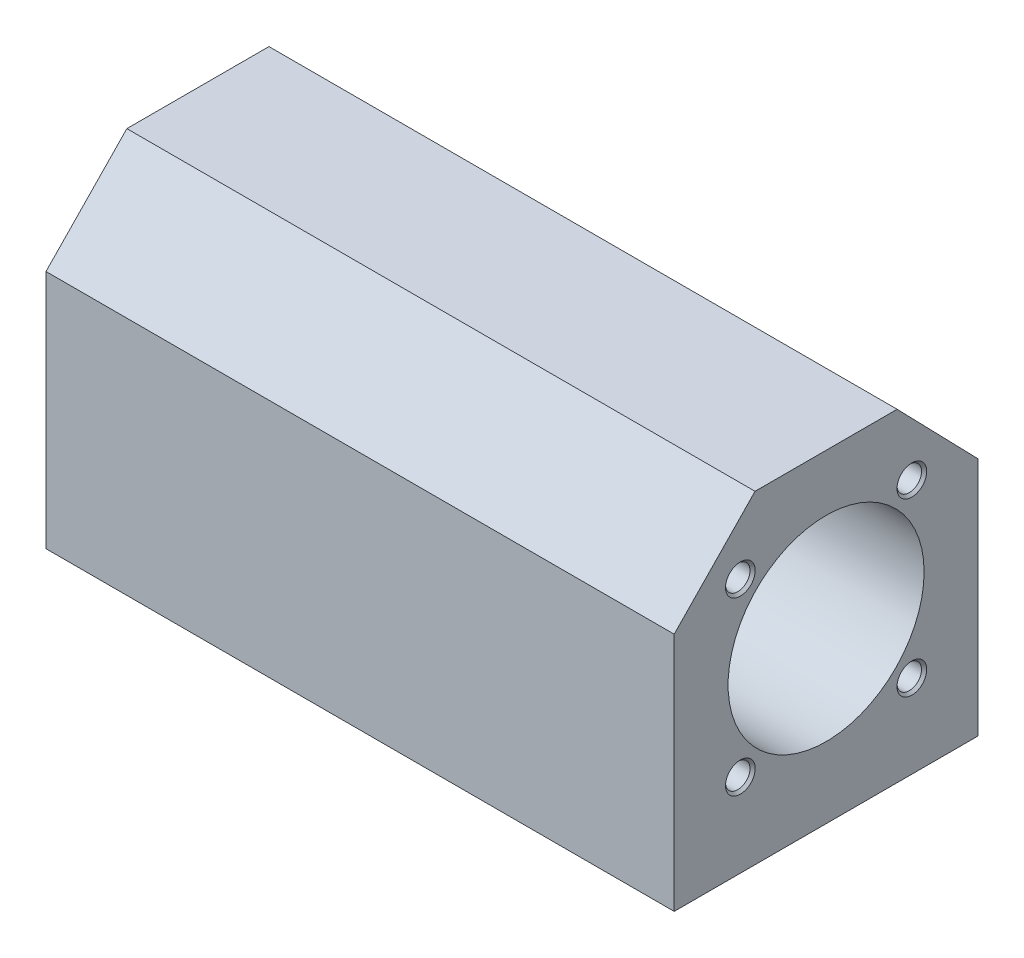
ISO-10303-21;
HEADER;
FILE_DESCRIPTION(('STEP AP214'),'2;1');
FILE_NAME('part.step','',(''),(''),'','','');
FILE_SCHEMA(('AUTOMOTIVE_DESIGN { 1 0 10303 214 1 1 1 1 }'));
ENDSEC;
DATA;
#1=APPLICATION_CONTEXT('core data for automotive mechanical design processes');
#2=APPLICATION_PROTOCOL_DEFINITION('international standard','automotive_design',2000,#1);
#3=PRODUCT_CONTEXT('',#1,'mechanical');
#4=PRODUCT('Part','Part','',(#3));
#5=PRODUCT_RELATED_PRODUCT_CATEGORY('part','',(#4));
#6=PRODUCT_DEFINITION_FORMATION('','',#4);
#7=PRODUCT_DEFINITION_CONTEXT('part definition',#1,'design');
#8=PRODUCT_DEFINITION('design','',#6,#7);
#9=PRODUCT_DEFINITION_SHAPE('','',#8);
#10=(LENGTH_UNIT() NAMED_UNIT(*) SI_UNIT(.MILLI.,.METRE.));
#11=(NAMED_UNIT(*) PLANE_ANGLE_UNIT() SI_UNIT($,.RADIAN.));
#12=(NAMED_UNIT(*) SI_UNIT($,.STERADIAN.) SOLID_ANGLE_UNIT());
#13=UNCERTAINTY_MEASURE_WITH_UNIT(LENGTH_MEASURE(1.E-05),#10,'distance_accuracy_value','');
#14=(GEOMETRIC_REPRESENTATION_CONTEXT(3) GLOBAL_UNCERTAINTY_ASSIGNED_CONTEXT((#13)) GLOBAL_UNIT_ASSIGNED_CONTEXT((#10,
#11,#12)) REPRESENTATION_CONTEXT('',''));
#15=CARTESIAN_POINT('',(0.,0.,0.));
#16=DIRECTION('',(0.,0.,1.));
#17=DIRECTION('',(1.,0.,0.));
#18=AXIS2_PLACEMENT_3D('',#15,#16,#17);
#19=CARTESIAN_POINT('',(-128.2,34.5,-31.));
#20=DIRECTION('',(1.,0.,0.));
#21=DIRECTION('',(0.,0.,-1.));
#22=AXIS2_PLACEMENT_3D('',#19,#20,#21);
#23=CYLINDRICAL_SURFACE('',#22,12.5);
#24=CARTESIAN_POINT('',(-78.2,34.5,-31.));
#25=DIRECTION('',(-1.,0.,0.));
#26=DIRECTION('',(0.,0.,1.));
#27=AXIS2_PLACEMENT_3D('',#24,#25,#26);
#28=CIRCLE('',#27,12.5);
#29=CARTESIAN_POINT('',(-78.2,34.5,-18.5));
#30=VERTEX_POINT('',#29);
#31=EDGE_CURVE('E168',#30,#30,#28,.F.);
#32=ORIENTED_EDGE('',*,*,#31,.F.);
#33=EDGE_LOOP('',(#32));
#34=FACE_BOUND('',#33,.T.);
#35=CARTESIAN_POINT('',(-70.,34.5,-31.));
#36=DIRECTION('',(1.,0.,0.));
#37=DIRECTION('',(0.,0.,-1.));
#38=AXIS2_PLACEMENT_3D('',#35,#36,#37);
#39=CIRCLE('',#38,12.5);
#40=CARTESIAN_POINT('',(-70.,34.5,-43.5));
#41=VERTEX_POINT('',#40);
#42=EDGE_CURVE('E45',#41,#41,#39,.F.);
#43=ORIENTED_EDGE('',*,*,#42,.F.);
#44=EDGE_LOOP('',(#43));
#45=FACE_BOUND('',#44,.T.);
#46=ADVANCED_FACE('F41',(#34,#45),#23,.F.);
#47=CARTESIAN_POINT('',(-128.2,0.,0.));
#48=DIRECTION('',(0.,0.,1.));
#49=DIRECTION('',(1.,0.,0.));
#50=AXIS2_PLACEMENT_3D('',#47,#48,#49);
#51=PLANE('',#50);
#52=DIRECTION('',(0.,-1.,0.));
#53=VECTOR('',#52,1.);
#54=CARTESIAN_POINT('',(0.,0.,0.));
#55=LINE('',#54,#53);
#56=CARTESIAN_POINT('',(0.,49.,0.));
#57=VERTEX_POINT('',#56);
#58=CARTESIAN_POINT('',(0.,0.,0.));
#59=VERTEX_POINT('',#58);
#60=EDGE_CURVE('E137',#57,#59,#55,.T.);
#61=ORIENTED_EDGE('',*,*,#60,.F.);
#62=DIRECTION('',(1.,0.,0.));
#63=VECTOR('',#62,1.);
#64=CARTESIAN_POINT('',(-128.2,49.,0.));
#65=LINE('',#64,#63);
#66=CARTESIAN_POINT('',(-128.2,49.,0.));
#67=VERTEX_POINT('',#66);
#68=EDGE_CURVE('E11',#67,#57,#65,.T.);
#69=ORIENTED_EDGE('',*,*,#68,.F.);
#70=DIRECTION('',(0.,-1.,0.));
#71=VECTOR('',#70,1.);
#72=CARTESIAN_POINT('',(-128.2,0.,0.));
#73=LINE('',#72,#71);
#74=CARTESIAN_POINT('',(-128.2,0.,0.));
#75=VERTEX_POINT('',#74);
#76=EDGE_CURVE('E158',#67,#75,#73,.T.);
#77=ORIENTED_EDGE('',*,*,#76,.T.);
#78=DIRECTION('',(1.,0.,0.));
#79=VECTOR('',#78,1.);
#80=CARTESIAN_POINT('',(-128.2,0.,0.));
#81=LINE('',#80,#79);
#82=EDGE_CURVE('E94',#75,#59,#81,.T.);
#83=ORIENTED_EDGE('',*,*,#82,.T.);
#84=EDGE_LOOP('',(#61,#69,#77,#83));
#85=FACE_BOUND('',#84,.T.);
#86=ADVANCED_FACE('F43',(#85),#51,.T.);
#87=CARTESIAN_POINT('',(-128.2,49.,0.));
#88=DIRECTION('',(0.,0.69647537716866,0.717580691628316));
#89=DIRECTION('',(0.,-0.717580691628316,0.69647537716866));
#90=AXIS2_PLACEMENT_3D('',#87,#88,#89);
#91=PLANE('',#90);
#92=DIRECTION('',(0.,-0.717580691628316,0.69647537716866));
#93=VECTOR('',#92,1.);
#94=CARTESIAN_POINT('',(0.,49.,0.));
#95=LINE('',#94,#93);
#96=CARTESIAN_POINT('',(0.,66.,-16.5));
#97=VERTEX_POINT('',#96);
#98=EDGE_CURVE('E155',#97,#57,#95,.T.);
#99=ORIENTED_EDGE('',*,*,#98,.F.);
#100=DIRECTION('',(1.,0.,0.));
#101=VECTOR('',#100,1.);
#102=CARTESIAN_POINT('',(-128.2,66.,-16.5));
#103=LINE('',#102,#101);
#104=CARTESIAN_POINT('',(-128.2,66.,-16.5));
#105=VERTEX_POINT('',#104);
#106=EDGE_CURVE('E52',#105,#97,#103,.T.);
#107=ORIENTED_EDGE('',*,*,#106,.F.);
#108=DIRECTION('',(0.,-0.717580691628316,0.69647537716866));
#109=VECTOR('',#108,1.);
#110=CARTESIAN_POINT('',(-128.2,49.,0.));
#111=LINE('',#110,#109);
#112=EDGE_CURVE('E123',#105,#67,#111,.T.);
#113=ORIENTED_EDGE('',*,*,#112,.T.);
#114=ORIENTED_EDGE('',*,*,#68,.T.);
#115=EDGE_LOOP('',(#99,#107,#113,#114));
#116=FACE_BOUND('',#115,.T.);
#117=ADVANCED_FACE('F240',(#116),#91,.T.);
#118=CARTESIAN_POINT('',(-128.2,66.,-16.5));
#119=DIRECTION('',(0.,1.,0.));
#120=DIRECTION('',(0.,0.,1.));
#121=AXIS2_PLACEMENT_3D('',#118,#119,#120);
#122=PLANE('',#121);
#123=DIRECTION('',(0.,0.,1.));
#124=VECTOR('',#123,1.);
#125=CARTESIAN_POINT('',(0.,66.,-16.5));
#126=LINE('',#125,#124);
#127=CARTESIAN_POINT('',(0.,66.,-45.5));
#128=VERTEX_POINT('',#127);
#129=EDGE_CURVE('E109',#128,#97,#126,.T.);
#130=ORIENTED_EDGE('',*,*,#129,.F.);
#131=DIRECTION('',(1.,0.,0.));
#132=VECTOR('',#131,1.);
#133=CARTESIAN_POINT('',(-128.2,66.,-45.5));
#134=LINE('',#133,#132);
#135=CARTESIAN_POINT('',(-128.2,66.,-45.5));
#136=VERTEX_POINT('',#135);
#137=EDGE_CURVE('E104',#136,#128,#134,.T.);
#138=ORIENTED_EDGE('',*,*,#137,.F.);
#139=DIRECTION('',(0.,0.,1.));
#140=VECTOR('',#139,1.);
#141=CARTESIAN_POINT('',(-128.2,66.,-16.5));
#142=LINE('',#141,#140);
#143=EDGE_CURVE('E107',#136,#105,#142,.T.);
#144=ORIENTED_EDGE('',*,*,#143,.T.);
#145=ORIENTED_EDGE('',*,*,#106,.T.);
#146=EDGE_LOOP('',(#130,#138,#144,#145));
#147=FACE_BOUND('',#146,.T.);
#148=ADVANCED_FACE('F106',(#147),#122,.T.);
#149=CARTESIAN_POINT('',(-128.2,66.,-45.5));
#150=DIRECTION('',(0.,0.69647537716866,-0.717580691628316));
#151=DIRECTION('',(0.,0.717580691628316,0.69647537716866));
#152=AXIS2_PLACEMENT_3D('',#149,#150,#151);
#153=PLANE('',#152);
#154=DIRECTION('',(0.,0.717580691628316,0.69647537716866));
#155=VECTOR('',#154,1.);
#156=CARTESIAN_POINT('',(0.,66.,-45.5));
#157=LINE('',#156,#155);
#158=CARTESIAN_POINT('',(0.,49.,-62.));
#159=VERTEX_POINT('',#158);
#160=EDGE_CURVE('E150',#159,#128,#157,.T.);
#161=ORIENTED_EDGE('',*,*,#160,.F.);
#162=DIRECTION('',(1.,0.,0.));
#163=VECTOR('',#162,1.);
#164=CARTESIAN_POINT('',(-128.2,49.,-62.));
#165=LINE('',#164,#163);
#166=CARTESIAN_POINT('',(-128.2,49.,-62.));
#167=VERTEX_POINT('',#166);
#168=EDGE_CURVE('E115',#167,#159,#165,.T.);
#169=ORIENTED_EDGE('',*,*,#168,.F.);
#170=DIRECTION('',(0.,0.717580691628316,0.69647537716866));
#171=VECTOR('',#170,1.);
#172=CARTESIAN_POINT('',(-128.2,66.,-45.5));
#173=LINE('',#172,#171);
#174=EDGE_CURVE('E121',#167,#136,#173,.T.);
#175=ORIENTED_EDGE('',*,*,#174,.T.);
#176=ORIENTED_EDGE('',*,*,#137,.T.);
#177=EDGE_LOOP('',(#161,#169,#175,#176));
#178=FACE_BOUND('',#177,.T.);
#179=ADVANCED_FACE('F126',(#178),#153,.T.);
#180=CARTESIAN_POINT('',(-128.2,0.,-62.));
#181=DIRECTION('',(0.,0.,-1.));
#182=DIRECTION('',(-1.,0.,0.));
#183=AXIS2_PLACEMENT_3D('',#180,#181,#182);
#184=PLANE('',#183);
#185=DIRECTION('',(0.,1.,0.));
#186=VECTOR('',#185,1.);
#187=CARTESIAN_POINT('',(0.,0.,-62.));
#188=LINE('',#187,#186);
#189=CARTESIAN_POINT('',(0.,0.,-62.));
#190=VERTEX_POINT('',#189);
#191=EDGE_CURVE('E146',#190,#159,#188,.T.);
#192=ORIENTED_EDGE('',*,*,#191,.F.);
#193=DIRECTION('',(1.,0.,0.));
#194=VECTOR('',#193,1.);
#195=CARTESIAN_POINT('',(-128.2,0.,-62.));
#196=LINE('',#195,#194);
#197=CARTESIAN_POINT('',(-128.2,0.,-62.));
#198=VERTEX_POINT('',#197);
#199=EDGE_CURVE('E164',#198,#190,#196,.T.);
#200=ORIENTED_EDGE('',*,*,#199,.F.);
#201=DIRECTION('',(0.,1.,0.));
#202=VECTOR('',#201,1.);
#203=CARTESIAN_POINT('',(-128.2,0.,-62.));
#204=LINE('',#203,#202);
#205=EDGE_CURVE('E128',#198,#167,#204,.T.);
#206=ORIENTED_EDGE('',*,*,#205,.T.);
#207=ORIENTED_EDGE('',*,*,#168,.T.);
#208=EDGE_LOOP('',(#192,#200,#206,#207));
#209=FACE_BOUND('',#208,.T.);
#210=ADVANCED_FACE('F453',(#209),#184,.T.);
#211=CARTESIAN_POINT('',(-128.2,0.,0.));
#212=DIRECTION('',(0.,-1.,0.));
#213=DIRECTION('',(0.,0.,-1.));
#214=AXIS2_PLACEMENT_3D('',#211,#212,#213);
#215=PLANE('',#214);
#216=DIRECTION('',(0.,0.,-1.));
#217=VECTOR('',#216,1.);
#218=CARTESIAN_POINT('',(0.,0.,0.));
#219=LINE('',#218,#217);
#220=EDGE_CURVE('E141',#59,#190,#219,.T.);
#221=ORIENTED_EDGE('',*,*,#220,.F.);
#222=ORIENTED_EDGE('',*,*,#82,.F.);
#223=DIRECTION('',(0.,0.,-1.));
#224=VECTOR('',#223,1.);
#225=CARTESIAN_POINT('',(-128.2,0.,0.));
#226=LINE('',#225,#224);
#227=EDGE_CURVE('E131',#75,#198,#226,.T.);
#228=ORIENTED_EDGE('',*,*,#227,.T.);
#229=ORIENTED_EDGE('',*,*,#199,.T.);
#230=EDGE_LOOP('',(#221,#222,#228,#229));
#231=FACE_BOUND('',#230,.T.);
#232=ADVANCED_FACE('F236',(#231),#215,.T.);
#233=CARTESIAN_POINT('',(-128.2,0.,0.));
#234=DIRECTION('',(-1.,0.,0.));
#235=DIRECTION('',(0.,0.,1.));
#236=AXIS2_PLACEMENT_3D('',#233,#234,#235);
#237=PLANE('',#236);
#238=CARTESIAN_POINT('',(-128.2,34.5,-31.));
#239=DIRECTION('',(-1.,0.,0.));
#240=DIRECTION('',(0.,0.,1.));
#241=AXIS2_PLACEMENT_3D('',#238,#239,#240);
#242=CIRCLE('',#241,29.);
#243=CARTESIAN_POINT('',(-128.2,34.5,-2.));
#244=VERTEX_POINT('',#243);
#245=EDGE_CURVE('E181',#244,#244,#242,.T.);
#246=ORIENTED_EDGE('',*,*,#245,.F.);
#247=EDGE_LOOP('',(#246));
#248=FACE_BOUND('',#247,.T.);
#249=ORIENTED_EDGE('',*,*,#76,.F.);
#250=ORIENTED_EDGE('',*,*,#112,.F.);
#251=ORIENTED_EDGE('',*,*,#143,.F.);
#252=ORIENTED_EDGE('',*,*,#174,.F.);
#253=ORIENTED_EDGE('',*,*,#205,.F.);
#254=ORIENTED_EDGE('',*,*,#227,.F.);
#255=EDGE_LOOP('',(#249,#250,#251,#252,#253,#254));
#256=FACE_BOUND('',#255,.T.);
#257=ADVANCED_FACE('F119',(#248,#256),#237,.T.);
#258=CARTESIAN_POINT('',(0.,0.,0.));
#259=DIRECTION('',(-1.,0.,0.));
#260=DIRECTION('',(0.,0.,1.));
#261=AXIS2_PLACEMENT_3D('',#258,#259,#260);
#262=PLANE('',#261);
#263=CARTESIAN_POINT('',(0.,34.5,-31.));
#264=DIRECTION('',(1.,0.,0.));
#265=DIRECTION('',(0.,0.,-1.));
#266=AXIS2_PLACEMENT_3D('',#263,#264,#265);
#267=CIRCLE('',#266,20.);
#268=CARTESIAN_POINT('',(0.,34.5,-51.));
#269=VERTEX_POINT('',#268);
#270=EDGE_CURVE('E189',#269,#269,#267,.T.);
#271=ORIENTED_EDGE('',*,*,#270,.F.);
#272=EDGE_LOOP('',(#271));
#273=FACE_BOUND('',#272,.T.);
#274=CARTESIAN_POINT('',(0.,52.,-13.5));
#275=DIRECTION('',(1.,0.,0.));
#276=DIRECTION('',(0.,0.,-1.));
#277=AXIS2_PLACEMENT_3D('',#274,#275,#276);
#278=CIRCLE('',#277,3.025);
#279=CARTESIAN_POINT('',(0.,52.,-16.525));
#280=VERTEX_POINT('',#279);
#281=EDGE_CURVE('E171',#280,#280,#278,.T.);
#282=ORIENTED_EDGE('',*,*,#281,.F.);
#283=EDGE_LOOP('',(#282));
#284=FACE_BOUND('',#283,.T.);
#285=CARTESIAN_POINT('',(0.,52.,-48.5));
#286=DIRECTION('',(1.,0.,0.));
#287=DIRECTION('',(0.,0.,-1.));
#288=AXIS2_PLACEMENT_3D('',#285,#286,#287);
#289=CIRCLE('',#288,3.025);
#290=CARTESIAN_POINT('',(0.,52.,-51.525));
#291=VERTEX_POINT('',#290);
#292=EDGE_CURVE('E199',#291,#291,#289,.T.);
#293=ORIENTED_EDGE('',*,*,#292,.F.);
#294=EDGE_LOOP('',(#293));
#295=FACE_BOUND('',#294,.T.);
#296=CARTESIAN_POINT('',(0.,17.,-48.5));
#297=DIRECTION('',(1.,0.,0.));
#298=DIRECTION('',(0.,0.,-1.));
#299=AXIS2_PLACEMENT_3D('',#296,#297,#298);
#300=CIRCLE('',#299,3.025);
#301=CARTESIAN_POINT('',(0.,17.,-51.525));
#302=VERTEX_POINT('',#301);
#303=EDGE_CURVE('E211',#302,#302,#300,.T.);
#304=ORIENTED_EDGE('',*,*,#303,.F.);
#305=EDGE_LOOP('',(#304));
#306=FACE_BOUND('',#305,.T.);
#307=CARTESIAN_POINT('',(0.,17.,-13.5));
#308=DIRECTION('',(1.,0.,0.));
#309=DIRECTION('',(0.,0.,-1.));
#310=AXIS2_PLACEMENT_3D('',#307,#308,#309);
#311=CIRCLE('',#310,3.025);
#312=CARTESIAN_POINT('',(0.,17.,-16.525));
#313=VERTEX_POINT('',#312);
#314=EDGE_CURVE('E223',#313,#313,#311,.T.);
#315=ORIENTED_EDGE('',*,*,#314,.F.);
#316=EDGE_LOOP('',(#315));
#317=FACE_BOUND('',#316,.T.);
#318=ORIENTED_EDGE('',*,*,#60,.T.);
#319=ORIENTED_EDGE('',*,*,#220,.T.);
#320=ORIENTED_EDGE('',*,*,#191,.T.);
#321=ORIENTED_EDGE('',*,*,#160,.T.);
#322=ORIENTED_EDGE('',*,*,#129,.T.);
#323=ORIENTED_EDGE('',*,*,#98,.T.);
#324=EDGE_LOOP('',(#318,#319,#320,#321,#322,#323));
#325=FACE_BOUND('',#324,.T.);
#326=ADVANCED_FACE('F239',(#273,#284,#295,#306,#317,#325),#262,.F.);
#327=CARTESIAN_POINT('',(-20.45,17.,-13.5));
#328=DIRECTION('',(1.,0.,0.));
#329=DIRECTION('',(0.,0.,-1.));
#330=AXIS2_PLACEMENT_3D('',#327,#328,#329);
#331=CONICAL_SURFACE('',#330,2.49999999999999,1.02974425867665);
#332=CARTESIAN_POINT('',(-21.9521515475689,17.,-13.5));
#333=VERTEX_POINT('',#332);
#334=VERTEX_LOOP('',#333);
#335=FACE_BOUND('',#334,.T.);
#336=CARTESIAN_POINT('',(-20.45,17.,-13.5));
#337=DIRECTION('',(1.,0.,0.));
#338=DIRECTION('',(0.,0.,-1.));
#339=AXIS2_PLACEMENT_3D('',#336,#337,#338);
#340=CIRCLE('',#339,2.49999999999999);
#341=CARTESIAN_POINT('',(-20.45,17.,-16.));
#342=VERTEX_POINT('',#341);
#343=EDGE_CURVE('E142',#342,#342,#340,.T.);
#344=ORIENTED_EDGE('',*,*,#343,.T.);
#345=EDGE_LOOP('',(#344));
#346=FACE_BOUND('',#345,.T.);
#347=ADVANCED_FACE('F303',(#335,#346),#331,.F.);
#348=CARTESIAN_POINT('',(0.,17.,-13.5));
#349=DIRECTION('',(1.,0.,0.));
#350=DIRECTION('',(0.,0.,-1.));
#351=AXIS2_PLACEMENT_3D('',#348,#349,#350);
#352=CYLINDRICAL_SURFACE('',#351,2.49999999999999);
#353=ORIENTED_EDGE('',*,*,#343,.F.);
#354=EDGE_LOOP('',(#353));
#355=FACE_BOUND('',#354,.T.);
#356=CARTESIAN_POINT('',(-0.525000000000001,17.,-13.5));
#357=DIRECTION('',(1.,0.,0.));
#358=DIRECTION('',(0.,0.,-1.));
#359=AXIS2_PLACEMENT_3D('',#356,#357,#358);
#360=CIRCLE('',#359,2.5);
#361=CARTESIAN_POINT('',(-0.525000000000001,17.,-16.));
#362=VERTEX_POINT('',#361);
#363=EDGE_CURVE('E227',#362,#362,#360,.T.);
#364=ORIENTED_EDGE('',*,*,#363,.T.);
#365=EDGE_LOOP('',(#364));
#366=FACE_BOUND('',#365,.T.);
#367=ADVANCED_FACE('F299',(#355,#366),#352,.F.);
#368=CARTESIAN_POINT('',(0.,17.,-13.5));
#369=DIRECTION('',(1.,0.,0.));
#370=DIRECTION('',(0.,0.,-1.));
#371=AXIS2_PLACEMENT_3D('',#368,#369,#370);
#372=CONICAL_SURFACE('',#371,3.025,0.785398163397447);
#373=ORIENTED_EDGE('',*,*,#363,.F.);
#374=EDGE_LOOP('',(#373));
#375=FACE_BOUND('',#374,.T.);
#376=ORIENTED_EDGE('',*,*,#314,.T.);
#377=EDGE_LOOP('',(#376));
#378=FACE_BOUND('',#377,.T.);
#379=ADVANCED_FACE('F295',(#375,#378),#372,.F.);
#380=CARTESIAN_POINT('',(-20.45,17.,-48.5));
#381=DIRECTION('',(1.,0.,0.));
#382=DIRECTION('',(0.,0.,-1.));
#383=AXIS2_PLACEMENT_3D('',#380,#381,#382);
#384=CONICAL_SURFACE('',#383,2.49999999999999,1.02974425867665);
#385=CARTESIAN_POINT('',(-21.9521515475689,17.,-48.5));
#386=VERTEX_POINT('',#385);
#387=VERTEX_LOOP('',#386);
#388=FACE_BOUND('',#387,.T.);
#389=CARTESIAN_POINT('',(-20.45,17.,-48.5));
#390=DIRECTION('',(1.,0.,0.));
#391=DIRECTION('',(0.,0.,-1.));
#392=AXIS2_PLACEMENT_3D('',#389,#390,#391);
#393=CIRCLE('',#392,2.49999999999999);
#394=CARTESIAN_POINT('',(-20.45,17.,-51.));
#395=VERTEX_POINT('',#394);
#396=EDGE_CURVE('E219',#395,#395,#393,.T.);
#397=ORIENTED_EDGE('',*,*,#396,.T.);
#398=EDGE_LOOP('',(#397));
#399=FACE_BOUND('',#398,.T.);
#400=ADVANCED_FACE('F291',(#388,#399),#384,.F.);
#401=CARTESIAN_POINT('',(0.,17.,-48.5));
#402=DIRECTION('',(1.,0.,0.));
#403=DIRECTION('',(0.,0.,-1.));
#404=AXIS2_PLACEMENT_3D('',#401,#402,#403);
#405=CYLINDRICAL_SURFACE('',#404,2.49999999999999);
#406=ORIENTED_EDGE('',*,*,#396,.F.);
#407=EDGE_LOOP('',(#406));
#408=FACE_BOUND('',#407,.T.);
#409=CARTESIAN_POINT('',(-0.525000000000001,17.,-48.5));
#410=DIRECTION('',(1.,0.,0.));
#411=DIRECTION('',(0.,0.,-1.));
#412=AXIS2_PLACEMENT_3D('',#409,#410,#411);
#413=CIRCLE('',#412,2.5);
#414=CARTESIAN_POINT('',(-0.525000000000001,17.,-51.));
#415=VERTEX_POINT('',#414);
#416=EDGE_CURVE('E215',#415,#415,#413,.T.);
#417=ORIENTED_EDGE('',*,*,#416,.T.);
#418=EDGE_LOOP('',(#417));
#419=FACE_BOUND('',#418,.T.);
#420=ADVANCED_FACE('F287',(#408,#419),#405,.F.);
#421=CARTESIAN_POINT('',(0.,17.,-48.5));
#422=DIRECTION('',(1.,0.,0.));
#423=DIRECTION('',(0.,0.,-1.));
#424=AXIS2_PLACEMENT_3D('',#421,#422,#423);
#425=CONICAL_SURFACE('',#424,3.025,0.785398163397447);
#426=ORIENTED_EDGE('',*,*,#416,.F.);
#427=EDGE_LOOP('',(#426));
#428=FACE_BOUND('',#427,.T.);
#429=ORIENTED_EDGE('',*,*,#303,.T.);
#430=EDGE_LOOP('',(#429));
#431=FACE_BOUND('',#430,.T.);
#432=ADVANCED_FACE('F283',(#428,#431),#425,.F.);
#433=CARTESIAN_POINT('',(-20.45,52.,-48.5));
#434=DIRECTION('',(1.,0.,0.));
#435=DIRECTION('',(0.,0.,-1.));
#436=AXIS2_PLACEMENT_3D('',#433,#434,#435);
#437=CONICAL_SURFACE('',#436,2.49999999999999,1.02974425867665);
#438=CARTESIAN_POINT('',(-21.9521515475689,52.,-48.5));
#439=VERTEX_POINT('',#438);
#440=VERTEX_LOOP('',#439);
#441=FACE_BOUND('',#440,.T.);
#442=CARTESIAN_POINT('',(-20.45,52.,-48.5));
#443=DIRECTION('',(1.,0.,0.));
#444=DIRECTION('',(0.,0.,-1.));
#445=AXIS2_PLACEMENT_3D('',#442,#443,#444);
#446=CIRCLE('',#445,2.49999999999999);
#447=CARTESIAN_POINT('',(-20.45,52.,-51.));
#448=VERTEX_POINT('',#447);
#449=EDGE_CURVE('E207',#448,#448,#446,.T.);
#450=ORIENTED_EDGE('',*,*,#449,.T.);
#451=EDGE_LOOP('',(#450));
#452=FACE_BOUND('',#451,.T.);
#453=ADVANCED_FACE('F279',(#441,#452),#437,.F.);
#454=CARTESIAN_POINT('',(0.,52.,-48.5));
#455=DIRECTION('',(1.,0.,0.));
#456=DIRECTION('',(0.,0.,-1.));
#457=AXIS2_PLACEMENT_3D('',#454,#455,#456);
#458=CYLINDRICAL_SURFACE('',#457,2.49999999999999);
#459=ORIENTED_EDGE('',*,*,#449,.F.);
#460=EDGE_LOOP('',(#459));
#461=FACE_BOUND('',#460,.T.);
#462=CARTESIAN_POINT('',(-0.525000000000001,52.,-48.5));
#463=DIRECTION('',(1.,0.,0.));
#464=DIRECTION('',(0.,0.,-1.));
#465=AXIS2_PLACEMENT_3D('',#462,#463,#464);
#466=CIRCLE('',#465,2.5);
#467=CARTESIAN_POINT('',(-0.525000000000001,52.,-51.));
#468=VERTEX_POINT('',#467);
#469=EDGE_CURVE('E203',#468,#468,#466,.T.);
#470=ORIENTED_EDGE('',*,*,#469,.T.);
#471=EDGE_LOOP('',(#470));
#472=FACE_BOUND('',#471,.T.);
#473=ADVANCED_FACE('F275',(#461,#472),#458,.F.);
#474=CARTESIAN_POINT('',(0.,52.,-48.5));
#475=DIRECTION('',(1.,0.,0.));
#476=DIRECTION('',(0.,0.,-1.));
#477=AXIS2_PLACEMENT_3D('',#474,#475,#476);
#478=CONICAL_SURFACE('',#477,3.025,0.78539816339745);
#479=ORIENTED_EDGE('',*,*,#469,.F.);
#480=EDGE_LOOP('',(#479));
#481=FACE_BOUND('',#480,.T.);
#482=ORIENTED_EDGE('',*,*,#292,.T.);
#483=EDGE_LOOP('',(#482));
#484=FACE_BOUND('',#483,.T.);
#485=ADVANCED_FACE('F271',(#481,#484),#478,.F.);
#486=CARTESIAN_POINT('',(-20.45,52.,-13.5));
#487=DIRECTION('',(1.,0.,0.));
#488=DIRECTION('',(0.,0.,-1.));
#489=AXIS2_PLACEMENT_3D('',#486,#487,#488);
#490=CONICAL_SURFACE('',#489,2.49999999999999,1.02974425867665);
#491=CARTESIAN_POINT('',(-21.9521515475689,52.,-13.5));
#492=VERTEX_POINT('',#491);
#493=VERTEX_LOOP('',#492);
#494=FACE_BOUND('',#493,.T.);
#495=CARTESIAN_POINT('',(-20.45,52.,-13.5));
#496=DIRECTION('',(1.,0.,0.));
#497=DIRECTION('',(0.,0.,-1.));
#498=AXIS2_PLACEMENT_3D('',#495,#496,#497);
#499=CIRCLE('',#498,2.49999999999999);
#500=CARTESIAN_POINT('',(-20.45,52.,-16.));
#501=VERTEX_POINT('',#500);
#502=EDGE_CURVE('E195',#501,#501,#499,.T.);
#503=ORIENTED_EDGE('',*,*,#502,.T.);
#504=EDGE_LOOP('',(#503));
#505=FACE_BOUND('',#504,.T.);
#506=ADVANCED_FACE('F267',(#494,#505),#490,.F.);
#507=CARTESIAN_POINT('',(0.,52.,-13.5));
#508=DIRECTION('',(1.,0.,0.));
#509=DIRECTION('',(0.,0.,-1.));
#510=AXIS2_PLACEMENT_3D('',#507,#508,#509);
#511=CYLINDRICAL_SURFACE('',#510,2.49999999999999);
#512=ORIENTED_EDGE('',*,*,#502,.F.);
#513=EDGE_LOOP('',(#512));
#514=FACE_BOUND('',#513,.T.);
#515=CARTESIAN_POINT('',(-0.525000000000001,52.,-13.5));
#516=DIRECTION('',(1.,0.,0.));
#517=DIRECTION('',(0.,0.,-1.));
#518=AXIS2_PLACEMENT_3D('',#515,#516,#517);
#519=CIRCLE('',#518,2.5);
#520=CARTESIAN_POINT('',(-0.525000000000001,52.,-16.));
#521=VERTEX_POINT('',#520);
#522=EDGE_CURVE('E178',#521,#521,#519,.T.);
#523=ORIENTED_EDGE('',*,*,#522,.T.);
#524=EDGE_LOOP('',(#523));
#525=FACE_BOUND('',#524,.T.);
#526=ADVANCED_FACE('F263',(#514,#525),#511,.F.);
#527=CARTESIAN_POINT('',(0.,52.,-13.5));
#528=DIRECTION('',(1.,0.,0.));
#529=DIRECTION('',(0.,0.,-1.));
#530=AXIS2_PLACEMENT_3D('',#527,#528,#529);
#531=CONICAL_SURFACE('',#530,3.025,0.78539816339745);
#532=ORIENTED_EDGE('',*,*,#522,.F.);
#533=EDGE_LOOP('',(#532));
#534=FACE_BOUND('',#533,.T.);
#535=ORIENTED_EDGE('',*,*,#281,.T.);
#536=EDGE_LOOP('',(#535));
#537=FACE_BOUND('',#536,.T.);
#538=ADVANCED_FACE('F259',(#534,#537),#531,.F.);
#539=CARTESIAN_POINT('',(-78.2,34.5,-31.));
#540=DIRECTION('',(-1.,0.,0.));
#541=DIRECTION('',(0.,0.,1.));
#542=AXIS2_PLACEMENT_3D('',#539,#540,#541);
#543=PLANE('',#542);
#544=CARTESIAN_POINT('',(-78.2,34.5,-31.));
#545=DIRECTION('',(-1.,0.,0.));
#546=DIRECTION('',(0.,0.,1.));
#547=AXIS2_PLACEMENT_3D('',#544,#545,#546);
#548=CIRCLE('',#547,29.);
#549=CARTESIAN_POINT('',(-78.2,34.5,-2.));
#550=VERTEX_POINT('',#549);
#551=EDGE_CURVE('E172',#550,#550,#548,.T.);
#552=ORIENTED_EDGE('',*,*,#551,.T.);
#553=EDGE_LOOP('',(#552));
#554=FACE_BOUND('',#553,.T.);
#555=ORIENTED_EDGE('',*,*,#31,.T.);
#556=EDGE_LOOP('',(#555));
#557=FACE_BOUND('',#556,.T.);
#558=ADVANCED_FACE('F262',(#554,#557),#543,.T.);
#559=CARTESIAN_POINT('',(-78.2,34.5,-31.));
#560=DIRECTION('',(-1.,0.,0.));
#561=DIRECTION('',(0.,0.,1.));
#562=AXIS2_PLACEMENT_3D('',#559,#560,#561);
#563=CYLINDRICAL_SURFACE('',#562,29.);
#564=ORIENTED_EDGE('',*,*,#551,.F.);
#565=EDGE_LOOP('',(#564));
#566=FACE_BOUND('',#565,.T.);
#567=ORIENTED_EDGE('',*,*,#245,.T.);
#568=EDGE_LOOP('',(#567));
#569=FACE_BOUND('',#568,.T.);
#570=ADVANCED_FACE('F257',(#566,#569),#563,.F.);
#571=CARTESIAN_POINT('',(-70.,34.5,-31.));
#572=DIRECTION('',(1.,0.,0.));
#573=DIRECTION('',(0.,0.,-1.));
#574=AXIS2_PLACEMENT_3D('',#571,#572,#573);
#575=PLANE('',#574);
#576=CARTESIAN_POINT('',(-70.,34.5,-31.));
#577=DIRECTION('',(1.,0.,0.));
#578=DIRECTION('',(0.,0.,-1.));
#579=AXIS2_PLACEMENT_3D('',#576,#577,#578);
#580=CIRCLE('',#579,20.);
#581=CARTESIAN_POINT('',(-70.,34.5,-51.));
#582=VERTEX_POINT('',#581);
#583=EDGE_CURVE('E330',#582,#582,#580,.T.);
#584=ORIENTED_EDGE('',*,*,#583,.T.);
#585=EDGE_LOOP('',(#584));
#586=FACE_BOUND('',#585,.T.);
#587=ORIENTED_EDGE('',*,*,#42,.T.);
#588=EDGE_LOOP('',(#587));
#589=FACE_BOUND('',#588,.T.);
#590=ADVANCED_FACE('F339',(#586,#589),#575,.T.);
#591=CARTESIAN_POINT('',(-70.,34.5,-31.));
#592=DIRECTION('',(1.,0.,0.));
#593=DIRECTION('',(0.,0.,-1.));
#594=AXIS2_PLACEMENT_3D('',#591,#592,#593);
#595=CYLINDRICAL_SURFACE('',#594,20.);
#596=ORIENTED_EDGE('',*,*,#583,.F.);
#597=EDGE_LOOP('',(#596));
#598=FACE_BOUND('',#597,.T.);
#599=ORIENTED_EDGE('',*,*,#270,.T.);
#600=EDGE_LOOP('',(#599));
#601=FACE_BOUND('',#600,.T.);
#602=ADVANCED_FACE('F341',(#598,#601),#595,.F.);
#603=CLOSED_SHELL('',(#46,#86,#117,#148,#179,#210,#232,#257,#326,#347,#367,#379,#400,#420,#432,
#453,#473,#485,#506,#526,#538,#558,#570,#590,#602));
#604=MANIFOLD_SOLID_BREP('B2',#603);
#605=ADVANCED_BREP_SHAPE_REPRESENTATION('',(#18,#604),#14);
#606=SHAPE_DEFINITION_REPRESENTATION(#9,#605);
ENDSEC;
END-ISO-10303-21;
